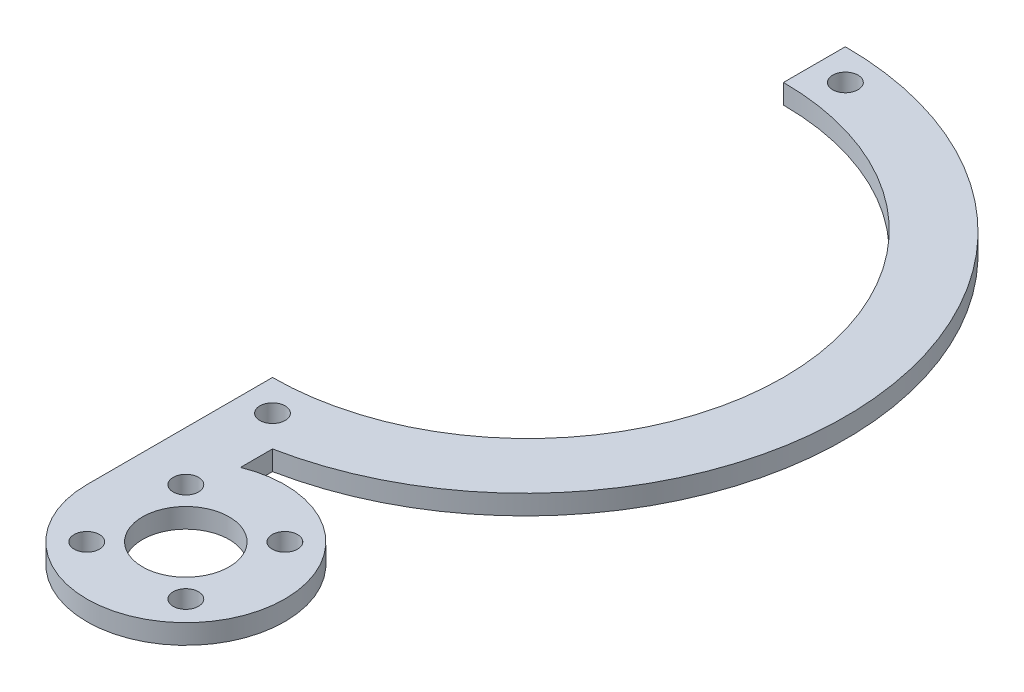
ISO-10303-21;
HEADER;
FILE_DESCRIPTION(('STEP AP214'),'2;1');
FILE_NAME('part.step','',(''),(''),'','','');
FILE_SCHEMA(('AUTOMOTIVE_DESIGN { 1 0 10303 214 1 1 1 1 }'));
ENDSEC;
DATA;
#1=APPLICATION_CONTEXT('core data for automotive mechanical design processes');
#2=APPLICATION_PROTOCOL_DEFINITION('international standard','automotive_design',2000,#1);
#3=PRODUCT_CONTEXT('',#1,'mechanical');
#4=PRODUCT('Part','Part','',(#3));
#5=PRODUCT_RELATED_PRODUCT_CATEGORY('part','',(#4));
#6=PRODUCT_DEFINITION_FORMATION('','',#4);
#7=PRODUCT_DEFINITION_CONTEXT('part definition',#1,'design');
#8=PRODUCT_DEFINITION('design','',#6,#7);
#9=PRODUCT_DEFINITION_SHAPE('','',#8);
#10=(LENGTH_UNIT() NAMED_UNIT(*) SI_UNIT(.MILLI.,.METRE.));
#11=(NAMED_UNIT(*) PLANE_ANGLE_UNIT() SI_UNIT($,.RADIAN.));
#12=(NAMED_UNIT(*) SI_UNIT($,.STERADIAN.) SOLID_ANGLE_UNIT());
#13=UNCERTAINTY_MEASURE_WITH_UNIT(LENGTH_MEASURE(1.E-05),#10,'distance_accuracy_value','');
#14=(GEOMETRIC_REPRESENTATION_CONTEXT(3) GLOBAL_UNCERTAINTY_ASSIGNED_CONTEXT((#13)) GLOBAL_UNIT_ASSIGNED_CONTEXT((#10,
#11,#12)) REPRESENTATION_CONTEXT('',''));
#15=CARTESIAN_POINT('',(0.,0.,0.));
#16=DIRECTION('',(0.,0.,1.));
#17=DIRECTION('',(1.,0.,0.));
#18=AXIS2_PLACEMENT_3D('',#15,#16,#17);
#19=CARTESIAN_POINT('',(0.,3.175,0.));
#20=DIRECTION('',(0.,1.,0.));
#21=DIRECTION('',(0.,0.,1.));
#22=AXIS2_PLACEMENT_3D('',#19,#20,#21);
#23=PLANE('',#22);
#24=CARTESIAN_POINT('',(-11.,3.175,-117.55));
#25=DIRECTION('',(0.,1.,0.));
#26=DIRECTION('',(0.,0.,-1.));
#27=AXIS2_PLACEMENT_3D('',#24,#25,#26);
#28=CIRCLE('',#27,2.05);
#29=CARTESIAN_POINT('',(-11.,3.175,-119.6));
#30=VERTEX_POINT('',#29);
#31=EDGE_CURVE('E174',#30,#30,#28,.T.);
#32=ORIENTED_EDGE('',*,*,#31,.F.);
#33=EDGE_LOOP('',(#32));
#34=FACE_BOUND('',#33,.T.);
#35=CARTESIAN_POINT('',(-8.,3.175,8.));
#36=DIRECTION('',(0.,1.,0.));
#37=DIRECTION('',(0.,0.,1.));
#38=AXIS2_PLACEMENT_3D('',#35,#36,#37);
#39=CIRCLE('',#38,2.05);
#40=CARTESIAN_POINT('',(-8.,3.175,10.05));
#41=VERTEX_POINT('',#40);
#42=EDGE_CURVE('E162',#41,#41,#39,.T.);
#43=ORIENTED_EDGE('',*,*,#42,.F.);
#44=EDGE_LOOP('',(#43));
#45=FACE_BOUND('',#44,.T.);
#46=CARTESIAN_POINT('',(8.,3.175,-8.));
#47=DIRECTION('',(0.,1.,0.));
#48=DIRECTION('',(0.,0.,1.));
#49=AXIS2_PLACEMENT_3D('',#46,#47,#48);
#50=CIRCLE('',#49,2.05);
#51=CARTESIAN_POINT('',(8.,3.175,-5.95));
#52=VERTEX_POINT('',#51);
#53=EDGE_CURVE('E150',#52,#52,#50,.T.);
#54=ORIENTED_EDGE('',*,*,#53,.F.);
#55=EDGE_LOOP('',(#54));
#56=FACE_BOUND('',#55,.T.);
#57=CARTESIAN_POINT('',(0.,3.175,0.));
#58=DIRECTION('',(0.,1.,0.));
#59=DIRECTION('',(0.,0.,1.));
#60=AXIS2_PLACEMENT_3D('',#57,#58,#59);
#61=CIRCLE('',#60,16.);
#62=CARTESIAN_POINT('',(-16.,3.175,0.));
#63=VERTEX_POINT('',#62);
#64=CARTESIAN_POINT('',(-6.,3.175,-14.8323969741913));
#65=VERTEX_POINT('',#64);
#66=EDGE_CURVE('E86',#63,#65,#61,.T.);
#67=ORIENTED_EDGE('',*,*,#66,.T.);
#68=DIRECTION('',(0.,0.,-1.));
#69=VECTOR('',#68,1.);
#70=CARTESIAN_POINT('',(-6.,3.175,-20.));
#71=LINE('',#70,#69);
#72=CARTESIAN_POINT('',(-6.,3.175,-20.));
#73=VERTEX_POINT('',#72);
#74=EDGE_CURVE('E143',#65,#73,#71,.T.);
#75=ORIENTED_EDGE('',*,*,#74,.T.);
#76=CARTESIAN_POINT('',(-16.0000000000009,3.175,-70.7874329595319));
#77=DIRECTION('',(0.,1.,0.));
#78=DIRECTION('',(0.,0.,-1.));
#79=AXIS2_PLACEMENT_3D('',#76,#77,#78);
#80=CIRCLE('',#79,51.7625670404681);
#81=CARTESIAN_POINT('',(-16.,3.175,-122.55));
#82=VERTEX_POINT('',#81);
#83=EDGE_CURVE('E100',#73,#82,#80,.T.);
#84=ORIENTED_EDGE('',*,*,#83,.T.);
#85=DIRECTION('',(4.44783099240427E-13,0.,1.));
#86=VECTOR('',#85,1.);
#87=CARTESIAN_POINT('',(-16.,3.175,-122.55));
#88=LINE('',#87,#86);
#89=CARTESIAN_POINT('',(-15.9999999999956,3.175,-112.549999999999));
#90=VERTEX_POINT('',#89);
#91=EDGE_CURVE('E94',#82,#90,#88,.T.);
#92=ORIENTED_EDGE('',*,*,#91,.T.);
#93=CARTESIAN_POINT('',(-15.9999999999997,3.175,-71.2749999999997));
#94=DIRECTION('',(0.,-1.,0.));
#95=DIRECTION('',(0.,0.,-1.));
#96=AXIS2_PLACEMENT_3D('',#93,#94,#95);
#97=CIRCLE('',#96,41.2749999999997);
#98=CARTESIAN_POINT('',(-16.,3.175,-30.));
#99=VERTEX_POINT('',#98);
#100=EDGE_CURVE('E98',#90,#99,#97,.T.);
#101=ORIENTED_EDGE('',*,*,#100,.T.);
#102=DIRECTION('',(0.,0.,1.));
#103=VECTOR('',#102,1.);
#104=CARTESIAN_POINT('',(-16.,3.175,-30.));
#105=LINE('',#104,#103);
#106=EDGE_CURVE('E50',#99,#63,#105,.T.);
#107=ORIENTED_EDGE('',*,*,#106,.T.);
#108=EDGE_LOOP('',(#67,#75,#84,#92,#101,#107));
#109=FACE_BOUND('',#108,.T.);
#110=CARTESIAN_POINT('',(-8.,3.175,-8.));
#111=DIRECTION('',(0.,1.,0.));
#112=DIRECTION('',(0.,0.,1.));
#113=AXIS2_PLACEMENT_3D('',#110,#111,#112);
#114=CIRCLE('',#113,2.05);
#115=CARTESIAN_POINT('',(-8.,3.175,-5.95));
#116=VERTEX_POINT('',#115);
#117=EDGE_CURVE('E120',#116,#116,#114,.T.);
#118=ORIENTED_EDGE('',*,*,#117,.F.);
#119=EDGE_LOOP('',(#118));
#120=FACE_BOUND('',#119,.T.);
#121=CARTESIAN_POINT('',(8.,3.175,8.));
#122=DIRECTION('',(0.,1.,0.));
#123=DIRECTION('',(0.,0.,1.));
#124=AXIS2_PLACEMENT_3D('',#121,#122,#123);
#125=CIRCLE('',#124,2.05);
#126=CARTESIAN_POINT('',(8.,3.175,10.05));
#127=VERTEX_POINT('',#126);
#128=EDGE_CURVE('E156',#127,#127,#125,.T.);
#129=ORIENTED_EDGE('',*,*,#128,.F.);
#130=EDGE_LOOP('',(#129));
#131=FACE_BOUND('',#130,.T.);
#132=CARTESIAN_POINT('',(-11.,3.175,-25.));
#133=DIRECTION('',(0.,1.,0.));
#134=DIRECTION('',(0.,0.,1.));
#135=AXIS2_PLACEMENT_3D('',#132,#133,#134);
#136=CIRCLE('',#135,2.05);
#137=CARTESIAN_POINT('',(-11.,3.175,-22.95));
#138=VERTEX_POINT('',#137);
#139=EDGE_CURVE('E168',#138,#138,#136,.T.);
#140=ORIENTED_EDGE('',*,*,#139,.F.);
#141=EDGE_LOOP('',(#140));
#142=FACE_BOUND('',#141,.T.);
#143=CARTESIAN_POINT('',(0.,3.175,0.));
#144=DIRECTION('',(0.,1.,0.));
#145=DIRECTION('',(0.,0.,1.));
#146=AXIS2_PLACEMENT_3D('',#143,#144,#145);
#147=CIRCLE('',#146,7.);
#148=CARTESIAN_POINT('',(0.,3.175,7.00000000000003));
#149=VERTEX_POINT('',#148);
#150=EDGE_CURVE('E180',#149,#149,#147,.T.);
#151=ORIENTED_EDGE('',*,*,#150,.F.);
#152=EDGE_LOOP('',(#151));
#153=FACE_BOUND('',#152,.T.);
#154=ADVANCED_FACE('F33',(#34,#45,#56,#109,#120,#131,#142,#153),#23,.T.);
#155=CARTESIAN_POINT('',(0.,0.,0.));
#156=DIRECTION('',(0.,1.,0.));
#157=DIRECTION('',(0.,0.,1.));
#158=AXIS2_PLACEMENT_3D('',#155,#156,#157);
#159=PLANE('',#158);
#160=CARTESIAN_POINT('',(0.,0.,0.));
#161=DIRECTION('',(0.,1.,0.));
#162=DIRECTION('',(0.,0.,1.));
#163=AXIS2_PLACEMENT_3D('',#160,#161,#162);
#164=CIRCLE('',#163,16.);
#165=CARTESIAN_POINT('',(-16.,0.,0.));
#166=VERTEX_POINT('',#165);
#167=CARTESIAN_POINT('',(-6.,0.,-14.8323969741913));
#168=VERTEX_POINT('',#167);
#169=EDGE_CURVE('E80',#166,#168,#164,.T.);
#170=ORIENTED_EDGE('',*,*,#169,.F.);
#171=DIRECTION('',(0.,0.,1.));
#172=VECTOR('',#171,1.);
#173=CARTESIAN_POINT('',(-16.,0.,-30.));
#174=LINE('',#173,#172);
#175=CARTESIAN_POINT('',(-16.,0.,-30.));
#176=VERTEX_POINT('',#175);
#177=EDGE_CURVE('E126',#176,#166,#174,.T.);
#178=ORIENTED_EDGE('',*,*,#177,.F.);
#179=CARTESIAN_POINT('',(-15.9999999999997,0.,-71.2749999999997));
#180=DIRECTION('',(0.,-1.,0.));
#181=DIRECTION('',(0.,0.,-1.));
#182=AXIS2_PLACEMENT_3D('',#179,#180,#181);
#183=CIRCLE('',#182,41.2749999999997);
#184=CARTESIAN_POINT('',(-15.9999999999956,0.,-112.549999999999));
#185=VERTEX_POINT('',#184);
#186=EDGE_CURVE('E73',#185,#176,#183,.T.);
#187=ORIENTED_EDGE('',*,*,#186,.F.);
#188=DIRECTION('',(4.44783099240427E-13,0.,1.));
#189=VECTOR('',#188,1.);
#190=CARTESIAN_POINT('',(-16.,0.,-122.55));
#191=LINE('',#190,#189);
#192=CARTESIAN_POINT('',(-16.,0.,-122.55));
#193=VERTEX_POINT('',#192);
#194=EDGE_CURVE('E108',#193,#185,#191,.T.);
#195=ORIENTED_EDGE('',*,*,#194,.F.);
#196=CARTESIAN_POINT('',(-16.0000000000009,0.,-70.7874329595319));
#197=DIRECTION('',(0.,1.,0.));
#198=DIRECTION('',(0.,0.,-1.));
#199=AXIS2_PLACEMENT_3D('',#196,#197,#198);
#200=CIRCLE('',#199,51.7625670404681);
#201=CARTESIAN_POINT('',(-6.,0.,-20.));
#202=VERTEX_POINT('',#201);
#203=EDGE_CURVE('E122',#202,#193,#200,.T.);
#204=ORIENTED_EDGE('',*,*,#203,.F.);
#205=DIRECTION('',(0.,0.,-1.));
#206=VECTOR('',#205,1.);
#207=CARTESIAN_POINT('',(-6.,0.,-20.));
#208=LINE('',#207,#206);
#209=EDGE_CURVE('E119',#168,#202,#208,.T.);
#210=ORIENTED_EDGE('',*,*,#209,.F.);
#211=EDGE_LOOP('',(#170,#178,#187,#195,#204,#210));
#212=FACE_BOUND('',#211,.T.);
#213=CARTESIAN_POINT('',(-8.,0.,-8.));
#214=DIRECTION('',(0.,1.,0.));
#215=DIRECTION('',(0.,0.,1.));
#216=AXIS2_PLACEMENT_3D('',#213,#214,#215);
#217=CIRCLE('',#216,2.05);
#218=CARTESIAN_POINT('',(-8.,0.,-5.95));
#219=VERTEX_POINT('',#218);
#220=EDGE_CURVE('E147',#219,#219,#217,.T.);
#221=ORIENTED_EDGE('',*,*,#220,.T.);
#222=EDGE_LOOP('',(#221));
#223=FACE_BOUND('',#222,.T.);
#224=CARTESIAN_POINT('',(8.,0.,-8.));
#225=DIRECTION('',(0.,1.,0.));
#226=DIRECTION('',(0.,0.,1.));
#227=AXIS2_PLACEMENT_3D('',#224,#225,#226);
#228=CIRCLE('',#227,2.05);
#229=CARTESIAN_POINT('',(8.,0.,-5.95));
#230=VERTEX_POINT('',#229);
#231=EDGE_CURVE('E153',#230,#230,#228,.T.);
#232=ORIENTED_EDGE('',*,*,#231,.T.);
#233=EDGE_LOOP('',(#232));
#234=FACE_BOUND('',#233,.T.);
#235=CARTESIAN_POINT('',(8.,0.,8.));
#236=DIRECTION('',(0.,1.,0.));
#237=DIRECTION('',(0.,0.,1.));
#238=AXIS2_PLACEMENT_3D('',#235,#236,#237);
#239=CIRCLE('',#238,2.05);
#240=CARTESIAN_POINT('',(8.,0.,10.05));
#241=VERTEX_POINT('',#240);
#242=EDGE_CURVE('E159',#241,#241,#239,.T.);
#243=ORIENTED_EDGE('',*,*,#242,.T.);
#244=EDGE_LOOP('',(#243));
#245=FACE_BOUND('',#244,.T.);
#246=CARTESIAN_POINT('',(-8.,0.,8.));
#247=DIRECTION('',(0.,1.,0.));
#248=DIRECTION('',(0.,0.,1.));
#249=AXIS2_PLACEMENT_3D('',#246,#247,#248);
#250=CIRCLE('',#249,2.05);
#251=CARTESIAN_POINT('',(-8.,0.,10.05));
#252=VERTEX_POINT('',#251);
#253=EDGE_CURVE('E165',#252,#252,#250,.T.);
#254=ORIENTED_EDGE('',*,*,#253,.T.);
#255=EDGE_LOOP('',(#254));
#256=FACE_BOUND('',#255,.T.);
#257=CARTESIAN_POINT('',(-11.,0.,-25.));
#258=DIRECTION('',(0.,1.,0.));
#259=DIRECTION('',(0.,0.,1.));
#260=AXIS2_PLACEMENT_3D('',#257,#258,#259);
#261=CIRCLE('',#260,2.05);
#262=CARTESIAN_POINT('',(-11.,0.,-22.95));
#263=VERTEX_POINT('',#262);
#264=EDGE_CURVE('E171',#263,#263,#261,.T.);
#265=ORIENTED_EDGE('',*,*,#264,.T.);
#266=EDGE_LOOP('',(#265));
#267=FACE_BOUND('',#266,.T.);
#268=CARTESIAN_POINT('',(-11.,0.,-117.55));
#269=DIRECTION('',(0.,1.,0.));
#270=DIRECTION('',(0.,0.,-1.));
#271=AXIS2_PLACEMENT_3D('',#268,#269,#270);
#272=CIRCLE('',#271,2.05);
#273=CARTESIAN_POINT('',(-11.,0.,-119.6));
#274=VERTEX_POINT('',#273);
#275=EDGE_CURVE('E177',#274,#274,#272,.T.);
#276=ORIENTED_EDGE('',*,*,#275,.T.);
#277=EDGE_LOOP('',(#276));
#278=FACE_BOUND('',#277,.T.);
#279=CARTESIAN_POINT('',(0.,0.,0.));
#280=DIRECTION('',(0.,1.,0.));
#281=DIRECTION('',(0.,0.,1.));
#282=AXIS2_PLACEMENT_3D('',#279,#280,#281);
#283=CIRCLE('',#282,7.);
#284=CARTESIAN_POINT('',(0.,0.,7.00000000000003));
#285=VERTEX_POINT('',#284);
#286=EDGE_CURVE('E183',#285,#285,#283,.T.);
#287=ORIENTED_EDGE('',*,*,#286,.T.);
#288=EDGE_LOOP('',(#287));
#289=FACE_BOUND('',#288,.T.);
#290=ADVANCED_FACE('F138',(#212,#223,#234,#245,#256,#267,#278,#289),#159,.F.);
#291=CARTESIAN_POINT('',(0.,3.175,0.));
#292=DIRECTION('',(0.,-1.,0.));
#293=DIRECTION('',(0.,0.,-1.));
#294=AXIS2_PLACEMENT_3D('',#291,#292,#293);
#295=CYLINDRICAL_SURFACE('',#294,16.);
#296=ORIENTED_EDGE('',*,*,#169,.T.);
#297=DIRECTION('',(0.,-1.,0.));
#298=VECTOR('',#297,1.);
#299=CARTESIAN_POINT('',(-6.,3.175,-14.8323969741913));
#300=LINE('',#299,#298);
#301=EDGE_CURVE('E11',#65,#168,#300,.T.);
#302=ORIENTED_EDGE('',*,*,#301,.F.);
#303=ORIENTED_EDGE('',*,*,#66,.F.);
#304=DIRECTION('',(0.,-1.,0.));
#305=VECTOR('',#304,1.);
#306=CARTESIAN_POINT('',(-16.,3.175,0.));
#307=LINE('',#306,#305);
#308=EDGE_CURVE('E114',#63,#166,#307,.T.);
#309=ORIENTED_EDGE('',*,*,#308,.T.);
#310=EDGE_LOOP('',(#296,#302,#303,#309));
#311=FACE_BOUND('',#310,.T.);
#312=ADVANCED_FACE('F35',(#311),#295,.T.);
#313=CARTESIAN_POINT('',(-6.,3.175,-20.));
#314=DIRECTION('',(-1.,0.,0.));
#315=DIRECTION('',(0.,0.,1.));
#316=AXIS2_PLACEMENT_3D('',#313,#314,#315);
#317=PLANE('',#316);
#318=ORIENTED_EDGE('',*,*,#209,.T.);
#319=DIRECTION('',(0.,-1.,0.));
#320=VECTOR('',#319,1.);
#321=CARTESIAN_POINT('',(-6.,3.175,-20.));
#322=LINE('',#321,#320);
#323=EDGE_CURVE('E42',#73,#202,#322,.T.);
#324=ORIENTED_EDGE('',*,*,#323,.F.);
#325=ORIENTED_EDGE('',*,*,#74,.F.);
#326=ORIENTED_EDGE('',*,*,#301,.T.);
#327=EDGE_LOOP('',(#318,#324,#325,#326));
#328=FACE_BOUND('',#327,.T.);
#329=ADVANCED_FACE('F212',(#328),#317,.F.);
#330=CARTESIAN_POINT('',(-16.0000000000009,3.175,-70.7874329595319));
#331=DIRECTION('',(0.,-1.,0.));
#332=DIRECTION('',(0.,0.,-1.));
#333=AXIS2_PLACEMENT_3D('',#330,#331,#332);
#334=CYLINDRICAL_SURFACE('',#333,51.7625670404681);
#335=ORIENTED_EDGE('',*,*,#203,.T.);
#336=DIRECTION('',(0.,-1.,0.));
#337=VECTOR('',#336,1.);
#338=CARTESIAN_POINT('',(-16.,3.175,-122.55));
#339=LINE('',#338,#337);
#340=EDGE_CURVE('E109',#82,#193,#339,.T.);
#341=ORIENTED_EDGE('',*,*,#340,.F.);
#342=ORIENTED_EDGE('',*,*,#83,.F.);
#343=ORIENTED_EDGE('',*,*,#323,.T.);
#344=EDGE_LOOP('',(#335,#341,#342,#343));
#345=FACE_BOUND('',#344,.T.);
#346=ADVANCED_FACE('F135',(#345),#334,.T.);
#347=CARTESIAN_POINT('',(-16.,3.175,-122.55));
#348=DIRECTION('',(1.,0.,-4.44783099240427E-13));
#349=DIRECTION('',(-4.44783099240427E-13,0.,-1.));
#350=AXIS2_PLACEMENT_3D('',#347,#348,#349);
#351=PLANE('',#350);
#352=ORIENTED_EDGE('',*,*,#194,.T.);
#353=DIRECTION('',(0.,-1.,0.));
#354=VECTOR('',#353,1.);
#355=CARTESIAN_POINT('',(-15.9999999999956,3.175,-112.549999999999));
#356=LINE('',#355,#354);
#357=EDGE_CURVE('E105',#90,#185,#356,.T.);
#358=ORIENTED_EDGE('',*,*,#357,.F.);
#359=ORIENTED_EDGE('',*,*,#91,.F.);
#360=ORIENTED_EDGE('',*,*,#340,.T.);
#361=EDGE_LOOP('',(#352,#358,#359,#360));
#362=FACE_BOUND('',#361,.T.);
#363=ADVANCED_FACE('F106',(#362),#351,.F.);
#364=CARTESIAN_POINT('',(-15.9999999999997,3.175,-71.2749999999997));
#365=DIRECTION('',(0.,-1.,0.));
#366=DIRECTION('',(0.,0.,-1.));
#367=AXIS2_PLACEMENT_3D('',#364,#365,#366);
#368=CYLINDRICAL_SURFACE('',#367,41.2749999999997);
#369=ORIENTED_EDGE('',*,*,#186,.T.);
#370=DIRECTION('',(0.,-1.,0.));
#371=VECTOR('',#370,1.);
#372=CARTESIAN_POINT('',(-16.,3.175,-30.));
#373=LINE('',#372,#371);
#374=EDGE_CURVE('E110',#99,#176,#373,.T.);
#375=ORIENTED_EDGE('',*,*,#374,.F.);
#376=ORIENTED_EDGE('',*,*,#100,.F.);
#377=ORIENTED_EDGE('',*,*,#357,.T.);
#378=EDGE_LOOP('',(#369,#375,#376,#377));
#379=FACE_BOUND('',#378,.T.);
#380=ADVANCED_FACE('F112',(#379),#368,.F.);
#381=CARTESIAN_POINT('',(-16.,3.175,-30.));
#382=DIRECTION('',(1.,0.,0.));
#383=DIRECTION('',(0.,0.,-1.));
#384=AXIS2_PLACEMENT_3D('',#381,#382,#383);
#385=PLANE('',#384);
#386=ORIENTED_EDGE('',*,*,#177,.T.);
#387=ORIENTED_EDGE('',*,*,#308,.F.);
#388=ORIENTED_EDGE('',*,*,#106,.F.);
#389=ORIENTED_EDGE('',*,*,#374,.T.);
#390=EDGE_LOOP('',(#386,#387,#388,#389));
#391=FACE_BOUND('',#390,.T.);
#392=ADVANCED_FACE('F141',(#391),#385,.F.);
#393=CARTESIAN_POINT('',(-8.,3.175,-8.));
#394=DIRECTION('',(0.,-1.,0.));
#395=DIRECTION('',(0.,0.,-1.));
#396=AXIS2_PLACEMENT_3D('',#393,#394,#395);
#397=CYLINDRICAL_SURFACE('',#396,2.05);
#398=ORIENTED_EDGE('',*,*,#117,.T.);
#399=EDGE_LOOP('',(#398));
#400=FACE_BOUND('',#399,.T.);
#401=ORIENTED_EDGE('',*,*,#220,.F.);
#402=EDGE_LOOP('',(#401));
#403=FACE_BOUND('',#402,.T.);
#404=ADVANCED_FACE('F202',(#400,#403),#397,.F.);
#405=CARTESIAN_POINT('',(8.,3.175,-8.));
#406=DIRECTION('',(0.,-1.,0.));
#407=DIRECTION('',(0.,0.,-1.));
#408=AXIS2_PLACEMENT_3D('',#405,#406,#407);
#409=CYLINDRICAL_SURFACE('',#408,2.05);
#410=ORIENTED_EDGE('',*,*,#53,.T.);
#411=EDGE_LOOP('',(#410));
#412=FACE_BOUND('',#411,.T.);
#413=ORIENTED_EDGE('',*,*,#231,.F.);
#414=EDGE_LOOP('',(#413));
#415=FACE_BOUND('',#414,.T.);
#416=ADVANCED_FACE('F266',(#412,#415),#409,.F.);
#417=CARTESIAN_POINT('',(8.,3.175,8.));
#418=DIRECTION('',(0.,-1.,0.));
#419=DIRECTION('',(0.,0.,-1.));
#420=AXIS2_PLACEMENT_3D('',#417,#418,#419);
#421=CYLINDRICAL_SURFACE('',#420,2.05);
#422=ORIENTED_EDGE('',*,*,#128,.T.);
#423=EDGE_LOOP('',(#422));
#424=FACE_BOUND('',#423,.T.);
#425=ORIENTED_EDGE('',*,*,#242,.F.);
#426=EDGE_LOOP('',(#425));
#427=FACE_BOUND('',#426,.T.);
#428=ADVANCED_FACE('F274',(#424,#427),#421,.F.);
#429=CARTESIAN_POINT('',(-8.,3.175,8.));
#430=DIRECTION('',(0.,-1.,0.));
#431=DIRECTION('',(0.,0.,-1.));
#432=AXIS2_PLACEMENT_3D('',#429,#430,#431);
#433=CYLINDRICAL_SURFACE('',#432,2.05);
#434=ORIENTED_EDGE('',*,*,#42,.T.);
#435=EDGE_LOOP('',(#434));
#436=FACE_BOUND('',#435,.T.);
#437=ORIENTED_EDGE('',*,*,#253,.F.);
#438=EDGE_LOOP('',(#437));
#439=FACE_BOUND('',#438,.T.);
#440=ADVANCED_FACE('F282',(#436,#439),#433,.F.);
#441=CARTESIAN_POINT('',(-11.,3.175,-25.));
#442=DIRECTION('',(0.,-1.,0.));
#443=DIRECTION('',(0.,0.,-1.));
#444=AXIS2_PLACEMENT_3D('',#441,#442,#443);
#445=CYLINDRICAL_SURFACE('',#444,2.05);
#446=ORIENTED_EDGE('',*,*,#139,.T.);
#447=EDGE_LOOP('',(#446));
#448=FACE_BOUND('',#447,.T.);
#449=ORIENTED_EDGE('',*,*,#264,.F.);
#450=EDGE_LOOP('',(#449));
#451=FACE_BOUND('',#450,.T.);
#452=ADVANCED_FACE('F291',(#448,#451),#445,.F.);
#453=CARTESIAN_POINT('',(-11.,3.175,-117.55));
#454=DIRECTION('',(0.,-1.,0.));
#455=DIRECTION('',(0.,0.,-1.));
#456=AXIS2_PLACEMENT_3D('',#453,#454,#455);
#457=CYLINDRICAL_SURFACE('',#456,2.05);
#458=ORIENTED_EDGE('',*,*,#31,.T.);
#459=EDGE_LOOP('',(#458));
#460=FACE_BOUND('',#459,.T.);
#461=ORIENTED_EDGE('',*,*,#275,.F.);
#462=EDGE_LOOP('',(#461));
#463=FACE_BOUND('',#462,.T.);
#464=ADVANCED_FACE('F300',(#460,#463),#457,.F.);
#465=CARTESIAN_POINT('',(0.,3.175,0.));
#466=DIRECTION('',(0.,-1.,0.));
#467=DIRECTION('',(0.,0.,-1.));
#468=AXIS2_PLACEMENT_3D('',#465,#466,#467);
#469=CYLINDRICAL_SURFACE('',#468,7.);
#470=ORIENTED_EDGE('',*,*,#150,.T.);
#471=EDGE_LOOP('',(#470));
#472=FACE_BOUND('',#471,.T.);
#473=ORIENTED_EDGE('',*,*,#286,.F.);
#474=EDGE_LOOP('',(#473));
#475=FACE_BOUND('',#474,.T.);
#476=ADVANCED_FACE('F189',(#472,#475),#469,.F.);
#477=CLOSED_SHELL('',(#154,#290,#312,#329,#346,#363,#380,#392,#404,#416,#428,#440,#452,#464,#476));
#478=MANIFOLD_SOLID_BREP('B2',#477);
#479=ADVANCED_BREP_SHAPE_REPRESENTATION('',(#18,#478),#14);
#480=SHAPE_DEFINITION_REPRESENTATION(#9,#479);
ENDSEC;
END-ISO-10303-21;
